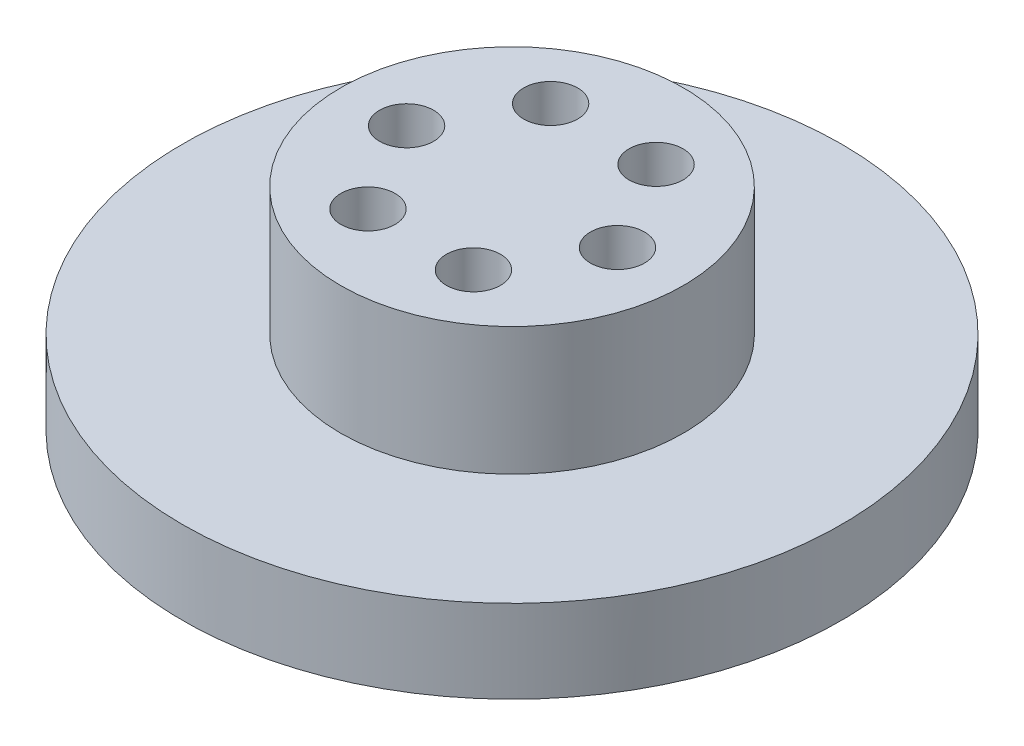
ISO-10303-21;
HEADER;
FILE_DESCRIPTION(('STEP AP214'),'2;1');
FILE_NAME('part.step','',(''),(''),'','','');
FILE_SCHEMA(('AUTOMOTIVE_DESIGN { 1 0 10303 214 1 1 1 1 }'));
ENDSEC;
DATA;
#1=APPLICATION_CONTEXT('core data for automotive mechanical design processes');
#2=APPLICATION_PROTOCOL_DEFINITION('international standard','automotive_design',2000,#1);
#3=PRODUCT_CONTEXT('',#1,'mechanical');
#4=PRODUCT('Part','Part','',(#3));
#5=PRODUCT_RELATED_PRODUCT_CATEGORY('part','',(#4));
#6=PRODUCT_DEFINITION_FORMATION('','',#4);
#7=PRODUCT_DEFINITION_CONTEXT('part definition',#1,'design');
#8=PRODUCT_DEFINITION('design','',#6,#7);
#9=PRODUCT_DEFINITION_SHAPE('','',#8);
#10=(LENGTH_UNIT() NAMED_UNIT(*) SI_UNIT(.MILLI.,.METRE.));
#11=(NAMED_UNIT(*) PLANE_ANGLE_UNIT() SI_UNIT($,.RADIAN.));
#12=(NAMED_UNIT(*) SI_UNIT($,.STERADIAN.) SOLID_ANGLE_UNIT());
#13=UNCERTAINTY_MEASURE_WITH_UNIT(LENGTH_MEASURE(1.E-05),#10,'distance_accuracy_value','');
#14=(GEOMETRIC_REPRESENTATION_CONTEXT(3) GLOBAL_UNCERTAINTY_ASSIGNED_CONTEXT((#13)) GLOBAL_UNIT_ASSIGNED_CONTEXT((#10,
#11,#12)) REPRESENTATION_CONTEXT('',''));
#15=CARTESIAN_POINT('',(0.,0.,0.));
#16=DIRECTION('',(0.,0.,1.));
#17=DIRECTION('',(1.,0.,0.));
#18=AXIS2_PLACEMENT_3D('',#15,#16,#17);
#19=CARTESIAN_POINT('',(0.,8.,0.));
#20=DIRECTION('',(0.,-1.,0.));
#21=DIRECTION('',(0.,0.,-1.));
#22=AXIS2_PLACEMENT_3D('',#19,#20,#21);
#23=CYLINDRICAL_SURFACE('',#22,25.);
#24=CARTESIAN_POINT('',(0.,6.,0.));
#25=DIRECTION('',(0.,1.,0.));
#26=DIRECTION('',(0.,0.,1.));
#27=AXIS2_PLACEMENT_3D('',#24,#25,#26);
#28=CIRCLE('',#27,25.);
#29=CARTESIAN_POINT('',(0.,6.,25.));
#30=VERTEX_POINT('',#29);
#31=EDGE_CURVE('E64',#30,#30,#28,.T.);
#32=ORIENTED_EDGE('',*,*,#31,.F.);
#33=EDGE_LOOP('',(#32));
#34=FACE_BOUND('',#33,.T.);
#35=CARTESIAN_POINT('',(0.,-0.3,0.));
#36=DIRECTION('',(0.,-1.,0.));
#37=DIRECTION('',(0.,0.,-1.));
#38=AXIS2_PLACEMENT_3D('',#35,#36,#37);
#39=CIRCLE('',#38,25.);
#40=CARTESIAN_POINT('',(0.,-0.3,-25.));
#41=VERTEX_POINT('',#40);
#42=EDGE_CURVE('E99',#41,#41,#39,.T.);
#43=ORIENTED_EDGE('',*,*,#42,.F.);
#44=EDGE_LOOP('',(#43));
#45=FACE_BOUND('',#44,.T.);
#46=ADVANCED_FACE('F43',(#34,#45),#23,.T.);
#47=CARTESIAN_POINT('',(25.,6.,0.));
#48=DIRECTION('',(0.,1.,0.));
#49=DIRECTION('',(0.,0.,1.));
#50=AXIS2_PLACEMENT_3D('',#47,#48,#49);
#51=PLANE('',#50);
#52=ORIENTED_EDGE('',*,*,#31,.T.);
#53=EDGE_LOOP('',(#52));
#54=FACE_BOUND('',#53,.T.);
#55=CARTESIAN_POINT('',(0.,6.,0.));
#56=DIRECTION('',(0.,1.,0.));
#57=DIRECTION('',(0.,0.,1.));
#58=AXIS2_PLACEMENT_3D('',#55,#56,#57);
#59=CIRCLE('',#58,13.);
#60=CARTESIAN_POINT('',(0.,6.,13.));
#61=VERTEX_POINT('',#60);
#62=EDGE_CURVE('E71',#61,#61,#59,.T.);
#63=ORIENTED_EDGE('',*,*,#62,.F.);
#64=EDGE_LOOP('',(#63));
#65=FACE_BOUND('',#64,.T.);
#66=ADVANCED_FACE('F177',(#54,#65),#51,.T.);
#67=CARTESIAN_POINT('',(0.,10.5,0.));
#68=DIRECTION('',(0.,1.,0.));
#69=DIRECTION('',(0.,0.,1.));
#70=AXIS2_PLACEMENT_3D('',#67,#68,#69);
#71=CYLINDRICAL_SURFACE('',#70,13.);
#72=ORIENTED_EDGE('',*,*,#62,.T.);
#73=EDGE_LOOP('',(#72));
#74=FACE_BOUND('',#73,.T.);
#75=CARTESIAN_POINT('',(0.,15.7,0.));
#76=DIRECTION('',(0.,1.,0.));
#77=DIRECTION('',(0.,0.,1.));
#78=AXIS2_PLACEMENT_3D('',#75,#76,#77);
#79=CIRCLE('',#78,13.);
#80=CARTESIAN_POINT('',(0.,15.7,13.));
#81=VERTEX_POINT('',#80);
#82=EDGE_CURVE('E131',#81,#81,#79,.T.);
#83=ORIENTED_EDGE('',*,*,#82,.F.);
#84=EDGE_LOOP('',(#83));
#85=FACE_BOUND('',#84,.T.);
#86=ADVANCED_FACE('F184',(#74,#85),#71,.T.);
#87=CARTESIAN_POINT('',(0.,-0.3,0.));
#88=DIRECTION('',(0.,-1.,0.));
#89=DIRECTION('',(0.,0.,-1.));
#90=AXIS2_PLACEMENT_3D('',#87,#88,#89);
#91=PLANE('',#90);
#92=CARTESIAN_POINT('',(0.,-0.3,16.));
#93=DIRECTION('',(0.,-1.,0.));
#94=DIRECTION('',(0.,0.,-1.));
#95=AXIS2_PLACEMENT_3D('',#92,#93,#94);
#96=CIRCLE('',#95,3.6);
#97=CARTESIAN_POINT('',(0.,-0.3,12.4));
#98=VERTEX_POINT('',#97);
#99=EDGE_CURVE('E125',#98,#98,#96,.T.);
#100=ORIENTED_EDGE('',*,*,#99,.F.);
#101=EDGE_LOOP('',(#100));
#102=FACE_BOUND('',#101,.T.);
#103=CARTESIAN_POINT('',(16.,-0.3,0.));
#104=DIRECTION('',(0.,-1.,0.));
#105=DIRECTION('',(0.,0.,-1.));
#106=AXIS2_PLACEMENT_3D('',#103,#104,#105);
#107=CIRCLE('',#106,3.6);
#108=CARTESIAN_POINT('',(16.,-0.3,-3.6));
#109=VERTEX_POINT('',#108);
#110=EDGE_CURVE('E119',#109,#109,#107,.T.);
#111=ORIENTED_EDGE('',*,*,#110,.F.);
#112=EDGE_LOOP('',(#111));
#113=FACE_BOUND('',#112,.T.);
#114=CARTESIAN_POINT('',(11.3137084989849,-0.3,-11.3137084989846));
#115=DIRECTION('',(0.,-1.,0.));
#116=DIRECTION('',(0.,0.,-1.));
#117=AXIS2_PLACEMENT_3D('',#114,#115,#116);
#118=CIRCLE('',#117,3.6);
#119=CARTESIAN_POINT('',(11.3137084989849,-0.3,-14.9137084989846));
#120=VERTEX_POINT('',#119);
#121=EDGE_CURVE('E113',#120,#120,#118,.T.);
#122=ORIENTED_EDGE('',*,*,#121,.F.);
#123=EDGE_LOOP('',(#122));
#124=FACE_BOUND('',#123,.T.);
#125=CARTESIAN_POINT('',(-11.3137084989847,-0.3,-11.3137084989849));
#126=DIRECTION('',(0.,-1.,0.));
#127=DIRECTION('',(0.,0.,-1.));
#128=AXIS2_PLACEMENT_3D('',#125,#126,#127);
#129=CIRCLE('',#128,3.6);
#130=CARTESIAN_POINT('',(-11.3137084989847,-0.3,-14.9137084989849));
#131=VERTEX_POINT('',#130);
#132=EDGE_CURVE('E107',#131,#131,#129,.T.);
#133=ORIENTED_EDGE('',*,*,#132,.F.);
#134=EDGE_LOOP('',(#133));
#135=FACE_BOUND('',#134,.T.);
#136=ORIENTED_EDGE('',*,*,#42,.T.);
#137=EDGE_LOOP('',(#136));
#138=FACE_BOUND('',#137,.T.);
#139=CARTESIAN_POINT('',(-16.,-0.3,0.));
#140=DIRECTION('',(0.,-1.,0.));
#141=DIRECTION('',(0.,0.,-1.));
#142=AXIS2_PLACEMENT_3D('',#139,#140,#141);
#143=CIRCLE('',#142,3.6);
#144=CARTESIAN_POINT('',(-16.,-0.3,-3.6));
#145=VERTEX_POINT('',#144);
#146=EDGE_CURVE('E104',#145,#145,#143,.T.);
#147=ORIENTED_EDGE('',*,*,#146,.F.);
#148=EDGE_LOOP('',(#147));
#149=FACE_BOUND('',#148,.T.);
#150=CARTESIAN_POINT('',(1.6759110426447E-13,-0.3,-16.));
#151=DIRECTION('',(0.,-1.,0.));
#152=DIRECTION('',(0.,0.,-1.));
#153=AXIS2_PLACEMENT_3D('',#150,#151,#152);
#154=CIRCLE('',#153,3.6);
#155=CARTESIAN_POINT('',(1.6759110426447E-13,-0.3,-19.6));
#156=VERTEX_POINT('',#155);
#157=EDGE_CURVE('E110',#156,#156,#154,.T.);
#158=ORIENTED_EDGE('',*,*,#157,.F.);
#159=EDGE_LOOP('',(#158));
#160=FACE_BOUND('',#159,.T.);
#161=CARTESIAN_POINT('',(0.,-0.3,0.));
#162=DIRECTION('',(0.,-1.,0.));
#163=DIRECTION('',(0.,0.,-1.));
#164=AXIS2_PLACEMENT_3D('',#161,#162,#163);
#165=CIRCLE('',#164,3.5);
#166=CARTESIAN_POINT('',(0.,-0.3,-3.5));
#167=VERTEX_POINT('',#166);
#168=EDGE_CURVE('E116',#167,#167,#165,.T.);
#169=ORIENTED_EDGE('',*,*,#168,.F.);
#170=EDGE_LOOP('',(#169));
#171=FACE_BOUND('',#170,.T.);
#172=CARTESIAN_POINT('',(11.3137084989847,-0.3,11.3137084989848));
#173=DIRECTION('',(0.,-1.,0.));
#174=DIRECTION('',(0.,0.,-1.));
#175=AXIS2_PLACEMENT_3D('',#172,#173,#174);
#176=CIRCLE('',#175,3.6);
#177=CARTESIAN_POINT('',(11.3137084989847,-0.3,7.71370849898478));
#178=VERTEX_POINT('',#177);
#179=EDGE_CURVE('E122',#178,#178,#176,.T.);
#180=ORIENTED_EDGE('',*,*,#179,.F.);
#181=EDGE_LOOP('',(#180));
#182=FACE_BOUND('',#181,.T.);
#183=CARTESIAN_POINT('',(-11.3137084989848,-0.3,11.3137084989847));
#184=DIRECTION('',(0.,-1.,0.));
#185=DIRECTION('',(0.,0.,-1.));
#186=AXIS2_PLACEMENT_3D('',#183,#184,#185);
#187=CIRCLE('',#186,3.6);
#188=CARTESIAN_POINT('',(-11.3137084989848,-0.3,7.7137084989847));
#189=VERTEX_POINT('',#188);
#190=EDGE_CURVE('E128',#189,#189,#187,.T.);
#191=ORIENTED_EDGE('',*,*,#190,.F.);
#192=EDGE_LOOP('',(#191));
#193=FACE_BOUND('',#192,.T.);
#194=ADVANCED_FACE('F191',(#102,#113,#124,#135,#138,#149,#160,#171,#182,#193),#91,.T.);
#195=CARTESIAN_POINT('',(0.,9.2,0.));
#196=DIRECTION('',(0.,-1.,0.));
#197=DIRECTION('',(0.,0.,-1.));
#198=AXIS2_PLACEMENT_3D('',#195,#196,#197);
#199=PLANE('',#198);
#200=CARTESIAN_POINT('',(0.,9.2,0.));
#201=DIRECTION('',(0.,-1.,0.));
#202=DIRECTION('',(0.,0.,-1.));
#203=AXIS2_PLACEMENT_3D('',#200,#201,#202);
#204=CIRCLE('',#203,3.5);
#205=CARTESIAN_POINT('',(0.,9.2,-3.5));
#206=VERTEX_POINT('',#205);
#207=EDGE_CURVE('E74',#206,#206,#204,.T.);
#208=ORIENTED_EDGE('',*,*,#207,.T.);
#209=EDGE_LOOP('',(#208));
#210=FACE_BOUND('',#209,.T.);
#211=ADVANCED_FACE('F193',(#210),#199,.T.);
#212=CARTESIAN_POINT('',(0.,9.2,0.));
#213=DIRECTION('',(0.,-1.,0.));
#214=DIRECTION('',(0.,0.,-1.));
#215=AXIS2_PLACEMENT_3D('',#212,#213,#214);
#216=CYLINDRICAL_SURFACE('',#215,3.5);
#217=ORIENTED_EDGE('',*,*,#207,.F.);
#218=EDGE_LOOP('',(#217));
#219=FACE_BOUND('',#218,.T.);
#220=ORIENTED_EDGE('',*,*,#168,.T.);
#221=EDGE_LOOP('',(#220));
#222=FACE_BOUND('',#221,.T.);
#223=ADVANCED_FACE('F249',(#219,#222),#216,.F.);
#224=CARTESIAN_POINT('',(0.,4.2,0.));
#225=DIRECTION('',(0.,-1.,0.));
#226=DIRECTION('',(0.,0.,-1.));
#227=AXIS2_PLACEMENT_3D('',#224,#225,#226);
#228=PLANE('',#227);
#229=CARTESIAN_POINT('',(16.,4.2,0.));
#230=DIRECTION('',(0.,-1.,0.));
#231=DIRECTION('',(0.,0.,-1.));
#232=AXIS2_PLACEMENT_3D('',#229,#230,#231);
#233=CIRCLE('',#232,3.6);
#234=CARTESIAN_POINT('',(16.,4.2,-3.6));
#235=VERTEX_POINT('',#234);
#236=EDGE_CURVE('E77',#235,#235,#233,.T.);
#237=ORIENTED_EDGE('',*,*,#236,.T.);
#238=EDGE_LOOP('',(#237));
#239=FACE_BOUND('',#238,.T.);
#240=ADVANCED_FACE('F246',(#239),#228,.T.);
#241=CARTESIAN_POINT('',(16.,4.2,0.));
#242=DIRECTION('',(0.,-1.,0.));
#243=DIRECTION('',(0.,0.,-1.));
#244=AXIS2_PLACEMENT_3D('',#241,#242,#243);
#245=CYLINDRICAL_SURFACE('',#244,3.6);
#246=ORIENTED_EDGE('',*,*,#236,.F.);
#247=EDGE_LOOP('',(#246));
#248=FACE_BOUND('',#247,.T.);
#249=ORIENTED_EDGE('',*,*,#110,.T.);
#250=EDGE_LOOP('',(#249));
#251=FACE_BOUND('',#250,.T.);
#252=ADVANCED_FACE('F240',(#248,#251),#245,.F.);
#253=CARTESIAN_POINT('',(0.,4.2,0.));
#254=DIRECTION('',(0.,-1.,0.));
#255=DIRECTION('',(0.707106781186549,0.,-0.707106781186546));
#256=AXIS2_PLACEMENT_3D('',#253,#254,#255);
#257=PLANE('',#256);
#258=CARTESIAN_POINT('',(11.3137084989847,4.2,11.3137084989848));
#259=DIRECTION('',(0.,-1.,0.));
#260=DIRECTION('',(0.707106781186549,0.,-0.707106781186546));
#261=AXIS2_PLACEMENT_3D('',#258,#259,#260);
#262=CIRCLE('',#261,3.6);
#263=CARTESIAN_POINT('',(13.8592929112563,4.2,8.76812408671321));
#264=VERTEX_POINT('',#263);
#265=EDGE_CURVE('E80',#264,#264,#262,.T.);
#266=ORIENTED_EDGE('',*,*,#265,.T.);
#267=EDGE_LOOP('',(#266));
#268=FACE_BOUND('',#267,.T.);
#269=ADVANCED_FACE('F236',(#268),#257,.T.);
#270=CARTESIAN_POINT('',(11.3137084989847,4.2,11.3137084989848));
#271=DIRECTION('',(0.,-1.,0.));
#272=DIRECTION('',(0.,0.,-1.));
#273=AXIS2_PLACEMENT_3D('',#270,#271,#272);
#274=CYLINDRICAL_SURFACE('',#273,3.6);
#275=ORIENTED_EDGE('',*,*,#265,.F.);
#276=EDGE_LOOP('',(#275));
#277=FACE_BOUND('',#276,.T.);
#278=ORIENTED_EDGE('',*,*,#179,.T.);
#279=EDGE_LOOP('',(#278));
#280=FACE_BOUND('',#279,.T.);
#281=ADVANCED_FACE('F239',(#277,#280),#274,.F.);
#282=CARTESIAN_POINT('',(0.,4.2,0.));
#283=DIRECTION('',(0.,-1.,0.));
#284=DIRECTION('',(-0.707106781186539,0.,-0.707106781186556));
#285=AXIS2_PLACEMENT_3D('',#282,#283,#284);
#286=PLANE('',#285);
#287=CARTESIAN_POINT('',(11.3137084989849,4.2,-11.3137084989846));
#288=DIRECTION('',(0.,-1.,0.));
#289=DIRECTION('',(-0.707106781186539,0.,-0.707106781186556));
#290=AXIS2_PLACEMENT_3D('',#287,#288,#289);
#291=CIRCLE('',#290,3.6);
#292=CARTESIAN_POINT('',(8.76812408671336,4.2,-13.8592929112562));
#293=VERTEX_POINT('',#292);
#294=EDGE_CURVE('E96',#293,#293,#291,.T.);
#295=ORIENTED_EDGE('',*,*,#294,.T.);
#296=EDGE_LOOP('',(#295));
#297=FACE_BOUND('',#296,.T.);
#298=ADVANCED_FACE('F244',(#297),#286,.T.);
#299=CARTESIAN_POINT('',(11.3137084989849,4.2,-11.3137084989846));
#300=DIRECTION('',(0.,-1.,0.));
#301=DIRECTION('',(0.,0.,-1.));
#302=AXIS2_PLACEMENT_3D('',#299,#300,#301);
#303=CYLINDRICAL_SURFACE('',#302,3.6);
#304=ORIENTED_EDGE('',*,*,#294,.F.);
#305=EDGE_LOOP('',(#304));
#306=FACE_BOUND('',#305,.T.);
#307=ORIENTED_EDGE('',*,*,#121,.T.);
#308=EDGE_LOOP('',(#307));
#309=FACE_BOUND('',#308,.T.);
#310=ADVANCED_FACE('F392',(#306,#309),#303,.F.);
#311=CARTESIAN_POINT('',(0.,4.2,0.));
#312=DIRECTION('',(0.,-1.,0.));
#313=DIRECTION('',(-1.,0.,0.));
#314=AXIS2_PLACEMENT_3D('',#311,#312,#313);
#315=PLANE('',#314);
#316=CARTESIAN_POINT('',(1.6759110426447E-13,4.2,-16.));
#317=DIRECTION('',(0.,-1.,0.));
#318=DIRECTION('',(-1.,0.,0.));
#319=AXIS2_PLACEMENT_3D('',#316,#317,#318);
#320=CIRCLE('',#319,3.6);
#321=CARTESIAN_POINT('',(-3.59999999999983,4.2,-16.));
#322=VERTEX_POINT('',#321);
#323=EDGE_CURVE('E88',#322,#322,#320,.T.);
#324=ORIENTED_EDGE('',*,*,#323,.T.);
#325=EDGE_LOOP('',(#324));
#326=FACE_BOUND('',#325,.T.);
#327=ADVANCED_FACE('F397',(#326),#315,.T.);
#328=CARTESIAN_POINT('',(1.6759110426447E-13,4.2,-16.));
#329=DIRECTION('',(0.,-1.,0.));
#330=DIRECTION('',(0.,0.,-1.));
#331=AXIS2_PLACEMENT_3D('',#328,#329,#330);
#332=CYLINDRICAL_SURFACE('',#331,3.6);
#333=ORIENTED_EDGE('',*,*,#323,.F.);
#334=EDGE_LOOP('',(#333));
#335=FACE_BOUND('',#334,.T.);
#336=ORIENTED_EDGE('',*,*,#157,.T.);
#337=EDGE_LOOP('',(#336));
#338=FACE_BOUND('',#337,.T.);
#339=ADVANCED_FACE('F231',(#335,#338),#332,.F.);
#340=CARTESIAN_POINT('',(0.,4.2,0.));
#341=DIRECTION('',(0.,-1.,0.));
#342=DIRECTION('',(-0.707106781186554,0.,0.707106781186541));
#343=AXIS2_PLACEMENT_3D('',#340,#341,#342);
#344=PLANE('',#343);
#345=CARTESIAN_POINT('',(-11.3137084989847,4.2,-11.3137084989849));
#346=DIRECTION('',(0.,-1.,0.));
#347=DIRECTION('',(-0.707106781186554,0.,0.707106781186541));
#348=AXIS2_PLACEMENT_3D('',#345,#346,#347);
#349=CIRCLE('',#348,3.6);
#350=CARTESIAN_POINT('',(-13.8592929112563,4.2,-8.76812408671331));
#351=VERTEX_POINT('',#350);
#352=EDGE_CURVE('E84',#351,#351,#349,.T.);
#353=ORIENTED_EDGE('',*,*,#352,.T.);
#354=EDGE_LOOP('',(#353));
#355=FACE_BOUND('',#354,.T.);
#356=ADVANCED_FACE('F228',(#355),#344,.T.);
#357=CARTESIAN_POINT('',(-11.3137084989847,4.2,-11.3137084989849));
#358=DIRECTION('',(0.,-1.,0.));
#359=DIRECTION('',(0.,0.,-1.));
#360=AXIS2_PLACEMENT_3D('',#357,#358,#359);
#361=CYLINDRICAL_SURFACE('',#360,3.6);
#362=ORIENTED_EDGE('',*,*,#352,.F.);
#363=EDGE_LOOP('',(#362));
#364=FACE_BOUND('',#363,.T.);
#365=ORIENTED_EDGE('',*,*,#132,.T.);
#366=EDGE_LOOP('',(#365));
#367=FACE_BOUND('',#366,.T.);
#368=ADVANCED_FACE('F224',(#364,#367),#361,.F.);
#369=CARTESIAN_POINT('',(0.,4.2,0.));
#370=DIRECTION('',(0.,-1.,0.));
#371=DIRECTION('',(0.,0.,1.));
#372=AXIS2_PLACEMENT_3D('',#369,#370,#371);
#373=PLANE('',#372);
#374=CARTESIAN_POINT('',(-16.,4.2,0.));
#375=DIRECTION('',(0.,-1.,0.));
#376=DIRECTION('',(0.,0.,1.));
#377=AXIS2_PLACEMENT_3D('',#374,#375,#376);
#378=CIRCLE('',#377,3.6);
#379=CARTESIAN_POINT('',(-16.,4.2,3.6));
#380=VERTEX_POINT('',#379);
#381=EDGE_CURVE('E87',#380,#380,#378,.T.);
#382=ORIENTED_EDGE('',*,*,#381,.T.);
#383=EDGE_LOOP('',(#382));
#384=FACE_BOUND('',#383,.T.);
#385=ADVANCED_FACE('F221',(#384),#373,.T.);
#386=CARTESIAN_POINT('',(-16.,4.2,0.));
#387=DIRECTION('',(0.,-1.,0.));
#388=DIRECTION('',(0.,0.,-1.));
#389=AXIS2_PLACEMENT_3D('',#386,#387,#388);
#390=CYLINDRICAL_SURFACE('',#389,3.6);
#391=ORIENTED_EDGE('',*,*,#381,.F.);
#392=EDGE_LOOP('',(#391));
#393=FACE_BOUND('',#392,.T.);
#394=ORIENTED_EDGE('',*,*,#146,.T.);
#395=EDGE_LOOP('',(#394));
#396=FACE_BOUND('',#395,.T.);
#397=ADVANCED_FACE('F216',(#393,#396),#390,.F.);
#398=CARTESIAN_POINT('',(0.,4.2,0.));
#399=DIRECTION('',(0.,-1.,0.));
#400=DIRECTION('',(0.707106781186544,0.,0.707106781186551));
#401=AXIS2_PLACEMENT_3D('',#398,#399,#400);
#402=PLANE('',#401);
#403=CARTESIAN_POINT('',(-11.3137084989848,4.2,11.3137084989847));
#404=DIRECTION('',(0.,-1.,0.));
#405=DIRECTION('',(0.707106781186544,0.,0.707106781186551));
#406=AXIS2_PLACEMENT_3D('',#403,#404,#405);
#407=CIRCLE('',#406,3.6);
#408=CARTESIAN_POINT('',(-8.76812408671326,4.2,13.8592929112563));
#409=VERTEX_POINT('',#408);
#410=EDGE_CURVE('E91',#409,#409,#407,.T.);
#411=ORIENTED_EDGE('',*,*,#410,.T.);
#412=EDGE_LOOP('',(#411));
#413=FACE_BOUND('',#412,.T.);
#414=ADVANCED_FACE('F207',(#413),#402,.T.);
#415=CARTESIAN_POINT('',(-11.3137084989848,4.2,11.3137084989847));
#416=DIRECTION('',(0.,-1.,0.));
#417=DIRECTION('',(0.,0.,-1.));
#418=AXIS2_PLACEMENT_3D('',#415,#416,#417);
#419=CYLINDRICAL_SURFACE('',#418,3.6);
#420=ORIENTED_EDGE('',*,*,#410,.F.);
#421=EDGE_LOOP('',(#420));
#422=FACE_BOUND('',#421,.T.);
#423=ORIENTED_EDGE('',*,*,#190,.T.);
#424=EDGE_LOOP('',(#423));
#425=FACE_BOUND('',#424,.T.);
#426=ADVANCED_FACE('F205',(#422,#425),#419,.F.);
#427=CARTESIAN_POINT('',(0.,4.2,0.));
#428=DIRECTION('',(0.,-1.,0.));
#429=DIRECTION('',(1.,0.,0.));
#430=AXIS2_PLACEMENT_3D('',#427,#428,#429);
#431=PLANE('',#430);
#432=CARTESIAN_POINT('',(0.,4.2,16.));
#433=DIRECTION('',(0.,-1.,0.));
#434=DIRECTION('',(1.,0.,0.));
#435=AXIS2_PLACEMENT_3D('',#432,#433,#434);
#436=CIRCLE('',#435,3.6);
#437=CARTESIAN_POINT('',(3.59999999999994,4.2,16.));
#438=VERTEX_POINT('',#437);
#439=EDGE_CURVE('E83',#438,#438,#436,.T.);
#440=ORIENTED_EDGE('',*,*,#439,.T.);
#441=EDGE_LOOP('',(#440));
#442=FACE_BOUND('',#441,.T.);
#443=ADVANCED_FACE('F170',(#442),#431,.T.);
#444=CARTESIAN_POINT('',(0.,4.2,16.));
#445=DIRECTION('',(0.,-1.,0.));
#446=DIRECTION('',(0.,0.,-1.));
#447=AXIS2_PLACEMENT_3D('',#444,#445,#446);
#448=CYLINDRICAL_SURFACE('',#447,3.6);
#449=ORIENTED_EDGE('',*,*,#439,.F.);
#450=EDGE_LOOP('',(#449));
#451=FACE_BOUND('',#450,.T.);
#452=ORIENTED_EDGE('',*,*,#99,.T.);
#453=EDGE_LOOP('',(#452));
#454=FACE_BOUND('',#453,.T.);
#455=ADVANCED_FACE('F158',(#451,#454),#448,.F.);
#456=CARTESIAN_POINT('',(0.,15.7,0.));
#457=DIRECTION('',(0.,1.,0.));
#458=DIRECTION('',(0.,0.,1.));
#459=AXIS2_PLACEMENT_3D('',#456,#457,#458);
#460=PLANE('',#459);
#461=CARTESIAN_POINT('',(-8.,15.7,0.));
#462=DIRECTION('',(0.,1.,0.));
#463=DIRECTION('',(0.,0.,1.));
#464=AXIS2_PLACEMENT_3D('',#461,#462,#463);
#465=CIRCLE('',#464,2.05);
#466=CARTESIAN_POINT('',(-8.,15.7,2.05));
#467=VERTEX_POINT('',#466);
#468=EDGE_CURVE('E146',#467,#467,#465,.T.);
#469=ORIENTED_EDGE('',*,*,#468,.F.);
#470=EDGE_LOOP('',(#469));
#471=FACE_BOUND('',#470,.T.);
#472=CARTESIAN_POINT('',(4.00000000000008,15.7,6.92820323027546));
#473=DIRECTION('',(0.,1.,0.));
#474=DIRECTION('',(0.,0.,1.));
#475=AXIS2_PLACEMENT_3D('',#472,#473,#474);
#476=CIRCLE('',#475,2.05);
#477=CARTESIAN_POINT('',(4.00000000000008,15.7,8.97820323027546));
#478=VERTEX_POINT('',#477);
#479=EDGE_CURVE('E140',#478,#478,#476,.T.);
#480=ORIENTED_EDGE('',*,*,#479,.F.);
#481=EDGE_LOOP('',(#480));
#482=FACE_BOUND('',#481,.T.);
#483=CARTESIAN_POINT('',(3.99999999999998,15.7,-6.92820323027552));
#484=DIRECTION('',(0.,1.,0.));
#485=DIRECTION('',(0.,0.,1.));
#486=AXIS2_PLACEMENT_3D('',#483,#484,#485);
#487=CIRCLE('',#486,2.05);
#488=CARTESIAN_POINT('',(3.99999999999998,15.7,-4.87820323027552));
#489=VERTEX_POINT('',#488);
#490=EDGE_CURVE('E134',#489,#489,#487,.T.);
#491=ORIENTED_EDGE('',*,*,#490,.F.);
#492=EDGE_LOOP('',(#491));
#493=FACE_BOUND('',#492,.T.);
#494=ORIENTED_EDGE('',*,*,#82,.T.);
#495=EDGE_LOOP('',(#494));
#496=FACE_BOUND('',#495,.T.);
#497=CARTESIAN_POINT('',(8.,15.7,0.));
#498=DIRECTION('',(0.,1.,0.));
#499=DIRECTION('',(0.,0.,1.));
#500=AXIS2_PLACEMENT_3D('',#497,#498,#499);
#501=CIRCLE('',#500,2.05);
#502=CARTESIAN_POINT('',(8.,15.7,2.05));
#503=VERTEX_POINT('',#502);
#504=EDGE_CURVE('E137',#503,#503,#501,.T.);
#505=ORIENTED_EDGE('',*,*,#504,.F.);
#506=EDGE_LOOP('',(#505));
#507=FACE_BOUND('',#506,.T.);
#508=CARTESIAN_POINT('',(-3.99999999999994,15.7,6.92820323027555));
#509=DIRECTION('',(0.,1.,0.));
#510=DIRECTION('',(0.,0.,1.));
#511=AXIS2_PLACEMENT_3D('',#508,#509,#510);
#512=CIRCLE('',#511,2.05);
#513=CARTESIAN_POINT('',(-3.99999999999994,15.7,8.97820323027555));
#514=VERTEX_POINT('',#513);
#515=EDGE_CURVE('E143',#514,#514,#512,.T.);
#516=ORIENTED_EDGE('',*,*,#515,.F.);
#517=EDGE_LOOP('',(#516));
#518=FACE_BOUND('',#517,.T.);
#519=CARTESIAN_POINT('',(-4.00000000000003,15.7,-6.92820323027549));
#520=DIRECTION('',(0.,1.,0.));
#521=DIRECTION('',(0.,0.,1.));
#522=AXIS2_PLACEMENT_3D('',#519,#520,#521);
#523=CIRCLE('',#522,2.05);
#524=CARTESIAN_POINT('',(-4.00000000000003,15.7,-4.87820323027549));
#525=VERTEX_POINT('',#524);
#526=EDGE_CURVE('E149',#525,#525,#523,.T.);
#527=ORIENTED_EDGE('',*,*,#526,.F.);
#528=EDGE_LOOP('',(#527));
#529=FACE_BOUND('',#528,.T.);
#530=ADVANCED_FACE('F155',(#471,#482,#493,#496,#507,#518,#529),#460,.T.);
#531=CARTESIAN_POINT('',(-8.,1.,0.));
#532=DIRECTION('',(0.,1.,0.));
#533=DIRECTION('',(0.,0.,-1.));
#534=AXIS2_PLACEMENT_3D('',#531,#532,#533);
#535=PLANE('',#534);
#536=CARTESIAN_POINT('',(-8.,1.,0.));
#537=DIRECTION('',(0.,1.,0.));
#538=DIRECTION('',(0.,0.,-1.));
#539=AXIS2_PLACEMENT_3D('',#536,#537,#538);
#540=CIRCLE('',#539,2.05);
#541=CARTESIAN_POINT('',(-8.,1.,-2.05));
#542=VERTEX_POINT('',#541);
#543=EDGE_CURVE('E57',#542,#542,#540,.T.);
#544=ORIENTED_EDGE('',*,*,#543,.T.);
#545=EDGE_LOOP('',(#544));
#546=FACE_BOUND('',#545,.T.);
#547=ADVANCED_FACE('F157',(#546),#535,.T.);
#548=CARTESIAN_POINT('',(-8.,1.,0.));
#549=DIRECTION('',(0.,1.,0.));
#550=DIRECTION('',(0.,0.,1.));
#551=AXIS2_PLACEMENT_3D('',#548,#549,#550);
#552=CYLINDRICAL_SURFACE('',#551,2.05);
#553=ORIENTED_EDGE('',*,*,#543,.F.);
#554=EDGE_LOOP('',(#553));
#555=FACE_BOUND('',#554,.T.);
#556=ORIENTED_EDGE('',*,*,#468,.T.);
#557=EDGE_LOOP('',(#556));
#558=FACE_BOUND('',#557,.T.);
#559=ADVANCED_FACE('F166',(#555,#558),#552,.F.);
#560=CARTESIAN_POINT('',(3.99999999999998,1.,-6.92820323027552));
#561=DIRECTION('',(0.,1.,0.));
#562=DIRECTION('',(0.86602540378444,0.,0.499999999999998));
#563=AXIS2_PLACEMENT_3D('',#560,#561,#562);
#564=PLANE('',#563);
#565=CARTESIAN_POINT('',(3.99999999999998,1.,-6.92820323027552));
#566=DIRECTION('',(0.,1.,0.));
#567=DIRECTION('',(0.86602540378444,0.,0.499999999999998));
#568=AXIS2_PLACEMENT_3D('',#565,#566,#567);
#569=CIRCLE('',#568,2.05);
#570=CARTESIAN_POINT('',(5.77535207775809,1.,-5.90320323027552));
#571=VERTEX_POINT('',#570);
#572=EDGE_CURVE('E49',#571,#571,#569,.T.);
#573=ORIENTED_EDGE('',*,*,#572,.T.);
#574=EDGE_LOOP('',(#573));
#575=FACE_BOUND('',#574,.T.);
#576=ADVANCED_FACE('F272',(#575),#564,.T.);
#577=CARTESIAN_POINT('',(3.99999999999998,1.,-6.92820323027552));
#578=DIRECTION('',(0.,1.,0.));
#579=DIRECTION('',(0.,0.,1.));
#580=AXIS2_PLACEMENT_3D('',#577,#578,#579);
#581=CYLINDRICAL_SURFACE('',#580,2.05);
#582=ORIENTED_EDGE('',*,*,#572,.F.);
#583=EDGE_LOOP('',(#582));
#584=FACE_BOUND('',#583,.T.);
#585=ORIENTED_EDGE('',*,*,#490,.T.);
#586=EDGE_LOOP('',(#585));
#587=FACE_BOUND('',#586,.T.);
#588=ADVANCED_FACE('F291',(#584,#587),#581,.F.);
#589=CARTESIAN_POINT('',(8.,1.,0.));
#590=DIRECTION('',(0.,1.,0.));
#591=DIRECTION('',(0.,0.,1.));
#592=AXIS2_PLACEMENT_3D('',#589,#590,#591);
#593=PLANE('',#592);
#594=CARTESIAN_POINT('',(8.,1.,0.));
#595=DIRECTION('',(0.,1.,0.));
#596=DIRECTION('',(0.,0.,1.));
#597=AXIS2_PLACEMENT_3D('',#594,#595,#596);
#598=CIRCLE('',#597,2.05);
#599=CARTESIAN_POINT('',(8.,1.,2.05));
#600=VERTEX_POINT('',#599);
#601=EDGE_CURVE('E10',#600,#600,#598,.T.);
#602=ORIENTED_EDGE('',*,*,#601,.T.);
#603=EDGE_LOOP('',(#602));
#604=FACE_BOUND('',#603,.T.);
#605=ADVANCED_FACE('F294',(#604),#593,.T.);
#606=CARTESIAN_POINT('',(8.,1.,0.));
#607=DIRECTION('',(0.,1.,0.));
#608=DIRECTION('',(0.,0.,1.));
#609=AXIS2_PLACEMENT_3D('',#606,#607,#608);
#610=CYLINDRICAL_SURFACE('',#609,2.05);
#611=ORIENTED_EDGE('',*,*,#601,.F.);
#612=EDGE_LOOP('',(#611));
#613=FACE_BOUND('',#612,.T.);
#614=ORIENTED_EDGE('',*,*,#504,.T.);
#615=EDGE_LOOP('',(#614));
#616=FACE_BOUND('',#615,.T.);
#617=ADVANCED_FACE('F265',(#613,#616),#610,.F.);
#618=CARTESIAN_POINT('',(-4.00000000000003,1.,-6.92820323027549));
#619=DIRECTION('',(0.,1.,0.));
#620=DIRECTION('',(0.866025403784436,0.,-0.500000000000004));
#621=AXIS2_PLACEMENT_3D('',#618,#619,#620);
#622=PLANE('',#621);
#623=CARTESIAN_POINT('',(-4.00000000000003,1.,-6.92820323027549));
#624=DIRECTION('',(0.,1.,0.));
#625=DIRECTION('',(0.866025403784436,0.,-0.500000000000004));
#626=AXIS2_PLACEMENT_3D('',#623,#624,#625);
#627=CIRCLE('',#626,2.05);
#628=CARTESIAN_POINT('',(-2.22464792224194,1.,-7.9532032302755));
#629=VERTEX_POINT('',#628);
#630=EDGE_CURVE('E53',#629,#629,#627,.T.);
#631=ORIENTED_EDGE('',*,*,#630,.T.);
#632=EDGE_LOOP('',(#631));
#633=FACE_BOUND('',#632,.T.);
#634=ADVANCED_FACE('F262',(#633),#622,.T.);
#635=CARTESIAN_POINT('',(-4.00000000000003,1.,-6.92820323027549));
#636=DIRECTION('',(0.,1.,0.));
#637=DIRECTION('',(0.,0.,1.));
#638=AXIS2_PLACEMENT_3D('',#635,#636,#637);
#639=CYLINDRICAL_SURFACE('',#638,2.05);
#640=ORIENTED_EDGE('',*,*,#630,.F.);
#641=EDGE_LOOP('',(#640));
#642=FACE_BOUND('',#641,.T.);
#643=ORIENTED_EDGE('',*,*,#526,.T.);
#644=EDGE_LOOP('',(#643));
#645=FACE_BOUND('',#644,.T.);
#646=ADVANCED_FACE('F153',(#642,#645),#639,.F.);
#647=CARTESIAN_POINT('',(-3.99999999999994,1.,6.92820323027555));
#648=DIRECTION('',(0.,1.,0.));
#649=DIRECTION('',(-0.866025403784443,0.,-0.499999999999992));
#650=AXIS2_PLACEMENT_3D('',#647,#648,#649);
#651=PLANE('',#650);
#652=CARTESIAN_POINT('',(-3.99999999999994,1.,6.92820323027555));
#653=DIRECTION('',(0.,1.,0.));
#654=DIRECTION('',(-0.866025403784443,0.,-0.499999999999992));
#655=AXIS2_PLACEMENT_3D('',#652,#653,#654);
#656=CIRCLE('',#655,2.05);
#657=CARTESIAN_POINT('',(-5.77535207775805,1.,5.90320323027556));
#658=VERTEX_POINT('',#657);
#659=EDGE_CURVE('E63',#658,#658,#656,.T.);
#660=ORIENTED_EDGE('',*,*,#659,.T.);
#661=EDGE_LOOP('',(#660));
#662=FACE_BOUND('',#661,.T.);
#663=ADVANCED_FACE('F268',(#662),#651,.T.);
#664=CARTESIAN_POINT('',(-3.99999999999994,1.,6.92820323027555));
#665=DIRECTION('',(0.,1.,0.));
#666=DIRECTION('',(0.,0.,1.));
#667=AXIS2_PLACEMENT_3D('',#664,#665,#666);
#668=CYLINDRICAL_SURFACE('',#667,2.05);
#669=ORIENTED_EDGE('',*,*,#659,.F.);
#670=EDGE_LOOP('',(#669));
#671=FACE_BOUND('',#670,.T.);
#672=ORIENTED_EDGE('',*,*,#515,.T.);
#673=EDGE_LOOP('',(#672));
#674=FACE_BOUND('',#673,.T.);
#675=ADVANCED_FACE('F276',(#671,#674),#668,.F.);
#676=CARTESIAN_POINT('',(4.00000000000008,1.,6.92820323027546));
#677=DIRECTION('',(0.,1.,0.));
#678=DIRECTION('',(-0.866025403784433,0.,0.50000000000001));
#679=AXIS2_PLACEMENT_3D('',#676,#677,#678);
#680=PLANE('',#679);
#681=CARTESIAN_POINT('',(4.00000000000008,1.,6.92820323027546));
#682=DIRECTION('',(0.,1.,0.));
#683=DIRECTION('',(-0.866025403784433,0.,0.50000000000001));
#684=AXIS2_PLACEMENT_3D('',#681,#682,#683);
#685=CIRCLE('',#684,2.05);
#686=CARTESIAN_POINT('',(2.22464792224199,1.,7.95320323027548));
#687=VERTEX_POINT('',#686);
#688=EDGE_CURVE('E60',#687,#687,#685,.T.);
#689=ORIENTED_EDGE('',*,*,#688,.T.);
#690=EDGE_LOOP('',(#689));
#691=FACE_BOUND('',#690,.T.);
#692=ADVANCED_FACE('F280',(#691),#680,.T.);
#693=CARTESIAN_POINT('',(4.00000000000008,1.,6.92820323027546));
#694=DIRECTION('',(0.,1.,0.));
#695=DIRECTION('',(0.,0.,1.));
#696=AXIS2_PLACEMENT_3D('',#693,#694,#695);
#697=CYLINDRICAL_SURFACE('',#696,2.05);
#698=ORIENTED_EDGE('',*,*,#688,.F.);
#699=EDGE_LOOP('',(#698));
#700=FACE_BOUND('',#699,.T.);
#701=ORIENTED_EDGE('',*,*,#479,.T.);
#702=EDGE_LOOP('',(#701));
#703=FACE_BOUND('',#702,.T.);
#704=ADVANCED_FACE('F284',(#700,#703),#697,.F.);
#705=CLOSED_SHELL('',(#46,#66,#86,#194,#211,#223,#240,#252,#269,#281,#298,#310,#327,#339,#356,
#368,#385,#397,#414,#426,#443,#455,#530,#547,#559,#576,#588,#605,#617,#634,#646,#663,#675,#692,#704));
#706=MANIFOLD_SOLID_BREP('B2',#705);
#707=ADVANCED_BREP_SHAPE_REPRESENTATION('',(#18,#706),#14);
#708=SHAPE_DEFINITION_REPRESENTATION(#9,#707);
ENDSEC;
END-ISO-10303-21;
